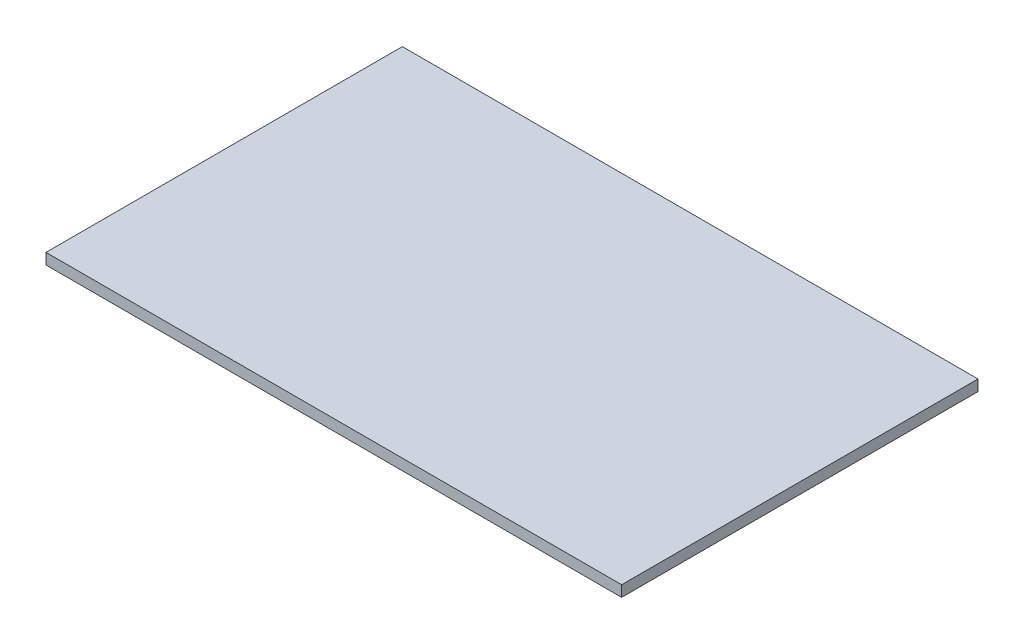
ISO-10303-21;
HEADER;
FILE_DESCRIPTION(('STEP AP214'),'2;1');
FILE_NAME('part.step','',(''),(''),'','','');
FILE_SCHEMA(('AUTOMOTIVE_DESIGN { 1 0 10303 214 1 1 1 1 }'));
ENDSEC;
DATA;
#1=APPLICATION_CONTEXT('core data for automotive mechanical design processes');
#2=APPLICATION_PROTOCOL_DEFINITION('international standard','automotive_design',2000,#1);
#3=PRODUCT_CONTEXT('',#1,'mechanical');
#4=PRODUCT('Part','Part','',(#3));
#5=PRODUCT_RELATED_PRODUCT_CATEGORY('part','',(#4));
#6=PRODUCT_DEFINITION_FORMATION('','',#4);
#7=PRODUCT_DEFINITION_CONTEXT('part definition',#1,'design');
#8=PRODUCT_DEFINITION('design','',#6,#7);
#9=PRODUCT_DEFINITION_SHAPE('','',#8);
#10=(LENGTH_UNIT() NAMED_UNIT(*) SI_UNIT(.MILLI.,.METRE.));
#11=(NAMED_UNIT(*) PLANE_ANGLE_UNIT() SI_UNIT($,.RADIAN.));
#12=(NAMED_UNIT(*) SI_UNIT($,.STERADIAN.) SOLID_ANGLE_UNIT());
#13=UNCERTAINTY_MEASURE_WITH_UNIT(LENGTH_MEASURE(1.E-05),#10,'distance_accuracy_value','');
#14=(GEOMETRIC_REPRESENTATION_CONTEXT(3) GLOBAL_UNCERTAINTY_ASSIGNED_CONTEXT((#13)) GLOBAL_UNIT_ASSIGNED_CONTEXT((#10,
#11,#12)) REPRESENTATION_CONTEXT('',''));
#15=CARTESIAN_POINT('',(0.,0.,0.));
#16=DIRECTION('',(0.,0.,1.));
#17=DIRECTION('',(1.,0.,0.));
#18=AXIS2_PLACEMENT_3D('',#15,#16,#17);
#19=CARTESIAN_POINT('',(0.,2.,-65.));
#20=DIRECTION('',(1.,0.,0.));
#21=DIRECTION('',(0.,0.,-1.));
#22=AXIS2_PLACEMENT_3D('',#19,#20,#21);
#23=PLANE('',#22);
#24=DIRECTION('',(0.,0.,1.));
#25=VECTOR('',#24,1.);
#26=CARTESIAN_POINT('',(0.,0.,-65.));
#27=LINE('',#26,#25);
#28=CARTESIAN_POINT('',(0.,0.,-65.));
#29=VERTEX_POINT('',#28);
#30=CARTESIAN_POINT('',(0.,0.,0.));
#31=VERTEX_POINT('',#30);
#32=EDGE_CURVE('E107',#29,#31,#27,.T.);
#33=ORIENTED_EDGE('',*,*,#32,.T.);
#34=DIRECTION('',(0.,-1.,0.));
#35=VECTOR('',#34,1.);
#36=CARTESIAN_POINT('',(0.,2.,0.));
#37=LINE('',#36,#35);
#38=CARTESIAN_POINT('',(0.,2.,0.));
#39=VERTEX_POINT('',#38);
#40=EDGE_CURVE('E11',#39,#31,#37,.T.);
#41=ORIENTED_EDGE('',*,*,#40,.F.);
#42=DIRECTION('',(0.,0.,1.));
#43=VECTOR('',#42,1.);
#44=CARTESIAN_POINT('',(0.,2.,-65.));
#45=LINE('',#44,#43);
#46=CARTESIAN_POINT('',(0.,2.,-65.));
#47=VERTEX_POINT('',#46);
#48=EDGE_CURVE('E91',#47,#39,#45,.T.);
#49=ORIENTED_EDGE('',*,*,#48,.F.);
#50=DIRECTION('',(0.,-1.,0.));
#51=VECTOR('',#50,1.);
#52=CARTESIAN_POINT('',(0.,2.,-65.));
#53=LINE('',#52,#51);
#54=EDGE_CURVE('E103',#47,#29,#53,.T.);
#55=ORIENTED_EDGE('',*,*,#54,.T.);
#56=EDGE_LOOP('',(#33,#41,#49,#55));
#57=FACE_BOUND('',#56,.T.);
#58=ADVANCED_FACE('F39',(#57),#23,.F.);
#59=CARTESIAN_POINT('',(0.,2.,0.));
#60=DIRECTION('',(0.,0.,-1.));
#61=DIRECTION('',(-1.,0.,0.));
#62=AXIS2_PLACEMENT_3D('',#59,#60,#61);
#63=PLANE('',#62);
#64=DIRECTION('',(1.,0.,0.));
#65=VECTOR('',#64,1.);
#66=CARTESIAN_POINT('',(0.,0.,0.));
#67=LINE('',#66,#65);
#68=CARTESIAN_POINT('',(105.,0.,0.));
#69=VERTEX_POINT('',#68);
#70=EDGE_CURVE('E96',#31,#69,#67,.T.);
#71=ORIENTED_EDGE('',*,*,#70,.T.);
#72=DIRECTION('',(0.,-1.,0.));
#73=VECTOR('',#72,1.);
#74=CARTESIAN_POINT('',(105.,2.,0.));
#75=LINE('',#74,#73);
#76=CARTESIAN_POINT('',(105.,2.,0.));
#77=VERTEX_POINT('',#76);
#78=EDGE_CURVE('E48',#77,#69,#75,.T.);
#79=ORIENTED_EDGE('',*,*,#78,.F.);
#80=DIRECTION('',(1.,0.,0.));
#81=VECTOR('',#80,1.);
#82=CARTESIAN_POINT('',(0.,2.,0.));
#83=LINE('',#82,#81);
#84=EDGE_CURVE('E86',#39,#77,#83,.T.);
#85=ORIENTED_EDGE('',*,*,#84,.F.);
#86=ORIENTED_EDGE('',*,*,#40,.T.);
#87=EDGE_LOOP('',(#71,#79,#85,#86));
#88=FACE_BOUND('',#87,.T.);
#89=ADVANCED_FACE('F95',(#88),#63,.F.);
#90=CARTESIAN_POINT('',(105.,2.,0.));
#91=DIRECTION('',(-1.,0.,0.));
#92=DIRECTION('',(0.,0.,1.));
#93=AXIS2_PLACEMENT_3D('',#90,#91,#92);
#94=PLANE('',#93);
#95=DIRECTION('',(0.,0.,-1.));
#96=VECTOR('',#95,1.);
#97=CARTESIAN_POINT('',(105.,0.,0.));
#98=LINE('',#97,#96);
#99=CARTESIAN_POINT('',(105.,0.,-65.));
#100=VERTEX_POINT('',#99);
#101=EDGE_CURVE('E73',#69,#100,#98,.T.);
#102=ORIENTED_EDGE('',*,*,#101,.T.);
#103=DIRECTION('',(0.,-1.,0.));
#104=VECTOR('',#103,1.);
#105=CARTESIAN_POINT('',(105.,2.,-65.));
#106=LINE('',#105,#104);
#107=CARTESIAN_POINT('',(105.,2.,-65.));
#108=VERTEX_POINT('',#107);
#109=EDGE_CURVE('E98',#108,#100,#106,.T.);
#110=ORIENTED_EDGE('',*,*,#109,.F.);
#111=DIRECTION('',(0.,0.,-1.));
#112=VECTOR('',#111,1.);
#113=CARTESIAN_POINT('',(105.,2.,0.));
#114=LINE('',#113,#112);
#115=EDGE_CURVE('E89',#77,#108,#114,.T.);
#116=ORIENTED_EDGE('',*,*,#115,.F.);
#117=ORIENTED_EDGE('',*,*,#78,.T.);
#118=EDGE_LOOP('',(#102,#110,#116,#117));
#119=FACE_BOUND('',#118,.T.);
#120=ADVANCED_FACE('F99',(#119),#94,.F.);
#121=CARTESIAN_POINT('',(105.,2.,-65.));
#122=DIRECTION('',(0.,0.,1.));
#123=DIRECTION('',(1.,0.,0.));
#124=AXIS2_PLACEMENT_3D('',#121,#122,#123);
#125=PLANE('',#124);
#126=DIRECTION('',(-1.,0.,0.));
#127=VECTOR('',#126,1.);
#128=CARTESIAN_POINT('',(105.,0.,-65.));
#129=LINE('',#128,#127);
#130=EDGE_CURVE('E79',#100,#29,#129,.T.);
#131=ORIENTED_EDGE('',*,*,#130,.T.);
#132=ORIENTED_EDGE('',*,*,#54,.F.);
#133=DIRECTION('',(-1.,0.,0.));
#134=VECTOR('',#133,1.);
#135=CARTESIAN_POINT('',(105.,2.,-65.));
#136=LINE('',#135,#134);
#137=EDGE_CURVE('E56',#108,#47,#136,.T.);
#138=ORIENTED_EDGE('',*,*,#137,.F.);
#139=ORIENTED_EDGE('',*,*,#109,.T.);
#140=EDGE_LOOP('',(#131,#132,#138,#139));
#141=FACE_BOUND('',#140,.T.);
#142=ADVANCED_FACE('F120',(#141),#125,.F.);
#143=CARTESIAN_POINT('',(0.,2.,0.));
#144=DIRECTION('',(0.,1.,0.));
#145=DIRECTION('',(0.,0.,1.));
#146=AXIS2_PLACEMENT_3D('',#143,#144,#145);
#147=PLANE('',#146);
#148=ORIENTED_EDGE('',*,*,#48,.T.);
#149=ORIENTED_EDGE('',*,*,#84,.T.);
#150=ORIENTED_EDGE('',*,*,#115,.T.);
#151=ORIENTED_EDGE('',*,*,#137,.T.);
#152=EDGE_LOOP('',(#148,#149,#150,#151));
#153=FACE_BOUND('',#152,.T.);
#154=ADVANCED_FACE('F87',(#153),#147,.T.);
#155=CARTESIAN_POINT('',(0.,0.,0.));
#156=DIRECTION('',(0.,1.,0.));
#157=DIRECTION('',(0.,0.,1.));
#158=AXIS2_PLACEMENT_3D('',#155,#156,#157);
#159=PLANE('',#158);
#160=ORIENTED_EDGE('',*,*,#32,.F.);
#161=ORIENTED_EDGE('',*,*,#130,.F.);
#162=ORIENTED_EDGE('',*,*,#101,.F.);
#163=ORIENTED_EDGE('',*,*,#70,.F.);
#164=EDGE_LOOP('',(#160,#161,#162,#163));
#165=FACE_BOUND('',#164,.T.);
#166=ADVANCED_FACE('F123',(#165),#159,.F.);
#167=CLOSED_SHELL('',(#58,#89,#120,#142,#154,#166));
#168=MANIFOLD_SOLID_BREP('B2',#167);
#169=ADVANCED_BREP_SHAPE_REPRESENTATION('',(#18,#168),#14);
#170=SHAPE_DEFINITION_REPRESENTATION(#9,#169);
ENDSEC;
END-ISO-10303-21;
